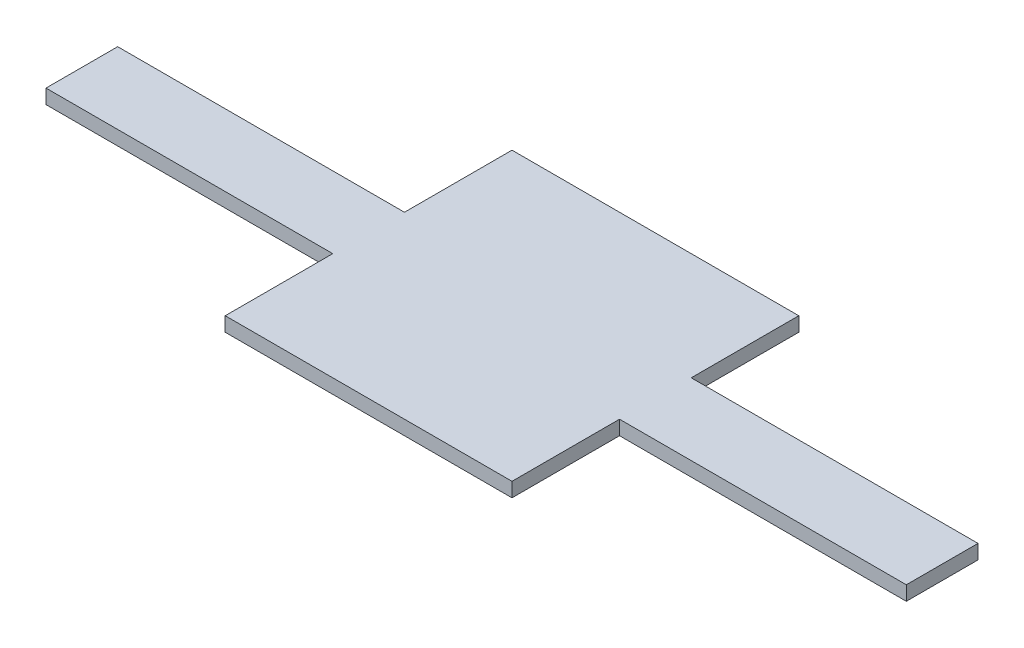
ISO-10303-21;
HEADER;
FILE_DESCRIPTION(('STEP AP214'),'2;1');
FILE_NAME('part.step','',(''),(''),'','','');
FILE_SCHEMA(('AUTOMOTIVE_DESIGN { 1 0 10303 214 1 1 1 1 }'));
ENDSEC;
DATA;
#1=APPLICATION_CONTEXT('core data for automotive mechanical design processes');
#2=APPLICATION_PROTOCOL_DEFINITION('international standard','automotive_design',2000,#1);
#3=PRODUCT_CONTEXT('',#1,'mechanical');
#4=PRODUCT('Part','Part','',(#3));
#5=PRODUCT_RELATED_PRODUCT_CATEGORY('part','',(#4));
#6=PRODUCT_DEFINITION_FORMATION('','',#4);
#7=PRODUCT_DEFINITION_CONTEXT('part definition',#1,'design');
#8=PRODUCT_DEFINITION('design','',#6,#7);
#9=PRODUCT_DEFINITION_SHAPE('','',#8);
#10=(LENGTH_UNIT() NAMED_UNIT(*) SI_UNIT(.MILLI.,.METRE.));
#11=(NAMED_UNIT(*) PLANE_ANGLE_UNIT() SI_UNIT($,.RADIAN.));
#12=(NAMED_UNIT(*) SI_UNIT($,.STERADIAN.) SOLID_ANGLE_UNIT());
#13=UNCERTAINTY_MEASURE_WITH_UNIT(LENGTH_MEASURE(1.E-05),#10,'distance_accuracy_value','');
#14=(GEOMETRIC_REPRESENTATION_CONTEXT(3) GLOBAL_UNCERTAINTY_ASSIGNED_CONTEXT((#13)) GLOBAL_UNIT_ASSIGNED_CONTEXT((#10,
#11,#12)) REPRESENTATION_CONTEXT('',''));
#15=CARTESIAN_POINT('',(0.,0.,0.));
#16=DIRECTION('',(0.,0.,1.));
#17=DIRECTION('',(1.,0.,0.));
#18=AXIS2_PLACEMENT_3D('',#15,#16,#17);
#19=CARTESIAN_POINT('',(0.,0.5,0.));
#20=DIRECTION('',(1.,0.,0.));
#21=DIRECTION('',(0.,0.,-1.));
#22=AXIS2_PLACEMENT_3D('',#19,#20,#21);
#23=PLANE('',#22);
#24=DIRECTION('',(0.,0.,1.));
#25=VECTOR('',#24,1.);
#26=CARTESIAN_POINT('',(0.,0.5,0.));
#27=LINE('',#26,#25);
#28=CARTESIAN_POINT('',(0.,0.5,-3.75));
#29=VERTEX_POINT('',#28);
#30=CARTESIAN_POINT('',(0.,0.5,0.));
#31=VERTEX_POINT('',#30);
#32=EDGE_CURVE('E188',#29,#31,#27,.T.);
#33=ORIENTED_EDGE('',*,*,#32,.F.);
#34=DIRECTION('',(0.,-1.,0.));
#35=VECTOR('',#34,1.);
#36=CARTESIAN_POINT('',(0.,0.5,-3.75));
#37=LINE('',#36,#35);
#38=CARTESIAN_POINT('',(0.,0.,-3.75));
#39=VERTEX_POINT('',#38);
#40=EDGE_CURVE('E180',#29,#39,#37,.T.);
#41=ORIENTED_EDGE('',*,*,#40,.T.);
#42=DIRECTION('',(0.,0.,1.));
#43=VECTOR('',#42,1.);
#44=CARTESIAN_POINT('',(0.,0.,0.));
#45=LINE('',#44,#43);
#46=CARTESIAN_POINT('',(0.,0.,0.));
#47=VERTEX_POINT('',#46);
#48=EDGE_CURVE('E183',#39,#47,#45,.T.);
#49=ORIENTED_EDGE('',*,*,#48,.T.);
#50=DIRECTION('',(0.,-1.,0.));
#51=VECTOR('',#50,1.);
#52=CARTESIAN_POINT('',(0.,0.5,0.));
#53=LINE('',#52,#51);
#54=EDGE_CURVE('E11',#31,#47,#53,.T.);
#55=ORIENTED_EDGE('',*,*,#54,.F.);
#56=EDGE_LOOP('',(#33,#41,#49,#55));
#57=FACE_BOUND('',#56,.T.);
#58=ADVANCED_FACE('F32',(#57),#23,.F.);
#59=CARTESIAN_POINT('',(10.,0.5,0.));
#60=DIRECTION('',(-1.,0.,0.));
#61=DIRECTION('',(0.,0.,1.));
#62=AXIS2_PLACEMENT_3D('',#59,#60,#61);
#63=PLANE('',#62);
#64=DIRECTION('',(0.,0.,-1.));
#65=VECTOR('',#64,1.);
#66=CARTESIAN_POINT('',(10.,0.,0.));
#67=LINE('',#66,#65);
#68=CARTESIAN_POINT('',(10.,0.,0.));
#69=VERTEX_POINT('',#68);
#70=CARTESIAN_POINT('',(10.,0.,-3.75));
#71=VERTEX_POINT('',#70);
#72=EDGE_CURVE('E200',#69,#71,#67,.T.);
#73=ORIENTED_EDGE('',*,*,#72,.T.);
#74=DIRECTION('',(0.,1.,0.));
#75=VECTOR('',#74,1.);
#76=CARTESIAN_POINT('',(10.,0.5,-3.75));
#77=LINE('',#76,#75);
#78=CARTESIAN_POINT('',(10.,0.5,-3.75));
#79=VERTEX_POINT('',#78);
#80=EDGE_CURVE('E55',#71,#79,#77,.T.);
#81=ORIENTED_EDGE('',*,*,#80,.T.);
#82=DIRECTION('',(0.,0.,-1.));
#83=VECTOR('',#82,1.);
#84=CARTESIAN_POINT('',(10.,0.5,0.));
#85=LINE('',#84,#83);
#86=CARTESIAN_POINT('',(10.,0.5,0.));
#87=VERTEX_POINT('',#86);
#88=EDGE_CURVE('E190',#87,#79,#85,.T.);
#89=ORIENTED_EDGE('',*,*,#88,.F.);
#90=DIRECTION('',(0.,-1.,0.));
#91=VECTOR('',#90,1.);
#92=CARTESIAN_POINT('',(10.,0.5,0.));
#93=LINE('',#92,#91);
#94=EDGE_CURVE('E40',#87,#69,#93,.T.);
#95=ORIENTED_EDGE('',*,*,#94,.T.);
#96=EDGE_LOOP('',(#73,#81,#89,#95));
#97=FACE_BOUND('',#96,.T.);
#98=ADVANCED_FACE('F210',(#97),#63,.F.);
#99=CARTESIAN_POINT('',(0.,0.,-10.));
#100=VERTEX_POINT('',#99);
#101=CARTESIAN_POINT('',(0.,0.,-6.25));
#102=VERTEX_POINT('',#101);
#103=EDGE_CURVE('E195',#100,#102,#45,.T.);
#104=ORIENTED_EDGE('',*,*,#103,.T.);
#105=DIRECTION('',(0.,1.,0.));
#106=VECTOR('',#105,1.);
#107=CARTESIAN_POINT('',(0.,0.5,-6.25));
#108=LINE('',#107,#106);
#109=CARTESIAN_POINT('',(0.,0.5,-6.25));
#110=VERTEX_POINT('',#109);
#111=EDGE_CURVE('E177',#102,#110,#108,.T.);
#112=ORIENTED_EDGE('',*,*,#111,.T.);
#113=CARTESIAN_POINT('',(0.,0.5,-10.));
#114=VERTEX_POINT('',#113);
#115=EDGE_CURVE('E184',#114,#110,#27,.T.);
#116=ORIENTED_EDGE('',*,*,#115,.F.);
#117=DIRECTION('',(0.,-1.,0.));
#118=VECTOR('',#117,1.);
#119=CARTESIAN_POINT('',(0.,0.5,-10.));
#120=LINE('',#119,#118);
#121=EDGE_CURVE('E194',#114,#100,#120,.T.);
#122=ORIENTED_EDGE('',*,*,#121,.T.);
#123=EDGE_LOOP('',(#104,#112,#116,#122));
#124=FACE_BOUND('',#123,.T.);
#125=ADVANCED_FACE('F34',(#124),#23,.F.);
#126=CARTESIAN_POINT('',(0.,0.5,0.));
#127=DIRECTION('',(0.,0.,-1.));
#128=DIRECTION('',(-1.,0.,0.));
#129=AXIS2_PLACEMENT_3D('',#126,#127,#128);
#130=PLANE('',#129);
#131=DIRECTION('',(1.,0.,0.));
#132=VECTOR('',#131,1.);
#133=CARTESIAN_POINT('',(0.,0.,0.));
#134=LINE('',#133,#132);
#135=EDGE_CURVE('E197',#47,#69,#134,.T.);
#136=ORIENTED_EDGE('',*,*,#135,.T.);
#137=ORIENTED_EDGE('',*,*,#94,.F.);
#138=DIRECTION('',(1.,0.,0.));
#139=VECTOR('',#138,1.);
#140=CARTESIAN_POINT('',(0.,0.5,0.));
#141=LINE('',#140,#139);
#142=EDGE_CURVE('E187',#31,#87,#141,.T.);
#143=ORIENTED_EDGE('',*,*,#142,.F.);
#144=ORIENTED_EDGE('',*,*,#54,.T.);
#145=EDGE_LOOP('',(#136,#137,#143,#144));
#146=FACE_BOUND('',#145,.T.);
#147=ADVANCED_FACE('F215',(#146),#130,.F.);
#148=CARTESIAN_POINT('',(10.,0.5,-6.25));
#149=VERTEX_POINT('',#148);
#150=CARTESIAN_POINT('',(10.,0.5,-10.));
#151=VERTEX_POINT('',#150);
#152=EDGE_CURVE('E47',#149,#151,#85,.T.);
#153=ORIENTED_EDGE('',*,*,#152,.F.);
#154=DIRECTION('',(0.,-1.,0.));
#155=VECTOR('',#154,1.);
#156=CARTESIAN_POINT('',(10.,0.5,-6.25));
#157=LINE('',#156,#155);
#158=CARTESIAN_POINT('',(10.,0.,-6.25));
#159=VERTEX_POINT('',#158);
#160=EDGE_CURVE('E166',#149,#159,#157,.T.);
#161=ORIENTED_EDGE('',*,*,#160,.T.);
#162=CARTESIAN_POINT('',(10.,0.,-10.));
#163=VERTEX_POINT('',#162);
#164=EDGE_CURVE('E199',#159,#163,#67,.T.);
#165=ORIENTED_EDGE('',*,*,#164,.T.);
#166=DIRECTION('',(0.,-1.,0.));
#167=VECTOR('',#166,1.);
#168=CARTESIAN_POINT('',(10.,0.5,-10.));
#169=LINE('',#168,#167);
#170=EDGE_CURVE('E206',#151,#163,#169,.T.);
#171=ORIENTED_EDGE('',*,*,#170,.F.);
#172=EDGE_LOOP('',(#153,#161,#165,#171));
#173=FACE_BOUND('',#172,.T.);
#174=ADVANCED_FACE('F237',(#173),#63,.F.);
#175=CARTESIAN_POINT('',(0.,0.5,-10.));
#176=DIRECTION('',(0.,0.,1.));
#177=DIRECTION('',(1.,0.,0.));
#178=AXIS2_PLACEMENT_3D('',#175,#176,#177);
#179=PLANE('',#178);
#180=DIRECTION('',(-1.,0.,0.));
#181=VECTOR('',#180,1.);
#182=CARTESIAN_POINT('',(0.,0.,-10.));
#183=LINE('',#182,#181);
#184=EDGE_CURVE('E202',#163,#100,#183,.T.);
#185=ORIENTED_EDGE('',*,*,#184,.T.);
#186=ORIENTED_EDGE('',*,*,#121,.F.);
#187=DIRECTION('',(-1.,0.,0.));
#188=VECTOR('',#187,1.);
#189=CARTESIAN_POINT('',(0.,0.5,-10.));
#190=LINE('',#189,#188);
#191=EDGE_CURVE('E192',#151,#114,#190,.T.);
#192=ORIENTED_EDGE('',*,*,#191,.F.);
#193=ORIENTED_EDGE('',*,*,#170,.T.);
#194=EDGE_LOOP('',(#185,#186,#192,#193));
#195=FACE_BOUND('',#194,.T.);
#196=ADVANCED_FACE('F236',(#195),#179,.F.);
#197=CARTESIAN_POINT('',(0.,0.5,0.));
#198=DIRECTION('',(0.,-1.,0.));
#199=DIRECTION('',(0.,0.,-1.));
#200=AXIS2_PLACEMENT_3D('',#197,#198,#199);
#201=PLANE('',#200);
#202=ORIENTED_EDGE('',*,*,#115,.T.);
#203=DIRECTION('',(1.,0.,0.));
#204=VECTOR('',#203,1.);
#205=CARTESIAN_POINT('',(-10.,0.5,-6.25));
#206=LINE('',#205,#204);
#207=CARTESIAN_POINT('',(-10.,0.5,-6.25));
#208=VERTEX_POINT('',#207);
#209=EDGE_CURVE('E168',#208,#110,#206,.T.);
#210=ORIENTED_EDGE('',*,*,#209,.F.);
#211=DIRECTION('',(0.,0.,1.));
#212=VECTOR('',#211,1.);
#213=CARTESIAN_POINT('',(-10.,0.5,-3.75));
#214=LINE('',#213,#212);
#215=CARTESIAN_POINT('',(-10.,0.5,-3.75));
#216=VERTEX_POINT('',#215);
#217=EDGE_CURVE('E132',#208,#216,#214,.T.);
#218=ORIENTED_EDGE('',*,*,#217,.T.);
#219=DIRECTION('',(1.,0.,0.));
#220=VECTOR('',#219,1.);
#221=CARTESIAN_POINT('',(-10.,0.5,-3.75));
#222=LINE('',#221,#220);
#223=EDGE_CURVE('E163',#216,#29,#222,.T.);
#224=ORIENTED_EDGE('',*,*,#223,.T.);
#225=ORIENTED_EDGE('',*,*,#32,.T.);
#226=ORIENTED_EDGE('',*,*,#142,.T.);
#227=ORIENTED_EDGE('',*,*,#88,.T.);
#228=CARTESIAN_POINT('',(20.,0.5,-3.75));
#229=VERTEX_POINT('',#228);
#230=EDGE_CURVE('E167',#79,#229,#222,.T.);
#231=ORIENTED_EDGE('',*,*,#230,.T.);
#232=DIRECTION('',(0.,0.,1.));
#233=VECTOR('',#232,1.);
#234=CARTESIAN_POINT('',(20.,0.5,-3.75));
#235=LINE('',#234,#233);
#236=CARTESIAN_POINT('',(20.,0.5,-6.25));
#237=VERTEX_POINT('',#236);
#238=EDGE_CURVE('E147',#237,#229,#235,.T.);
#239=ORIENTED_EDGE('',*,*,#238,.F.);
#240=EDGE_CURVE('E171',#149,#237,#206,.T.);
#241=ORIENTED_EDGE('',*,*,#240,.F.);
#242=ORIENTED_EDGE('',*,*,#152,.T.);
#243=ORIENTED_EDGE('',*,*,#191,.T.);
#244=EDGE_LOOP('',(#202,#210,#218,#224,#225,#226,#227,#231,#239,#241,#242,#243));
#245=FACE_BOUND('',#244,.T.);
#246=ADVANCED_FACE('F242',(#245),#201,.F.);
#247=CARTESIAN_POINT('',(0.,0.,0.));
#248=DIRECTION('',(0.,-1.,0.));
#249=DIRECTION('',(0.,0.,-1.));
#250=AXIS2_PLACEMENT_3D('',#247,#248,#249);
#251=PLANE('',#250);
#252=ORIENTED_EDGE('',*,*,#164,.F.);
#253=DIRECTION('',(1.,0.,0.));
#254=VECTOR('',#253,1.);
#255=CARTESIAN_POINT('',(-10.,0.,-6.25));
#256=LINE('',#255,#254);
#257=CARTESIAN_POINT('',(20.,0.,-6.25));
#258=VERTEX_POINT('',#257);
#259=EDGE_CURVE('E138',#159,#258,#256,.T.);
#260=ORIENTED_EDGE('',*,*,#259,.T.);
#261=DIRECTION('',(0.,0.,-1.));
#262=VECTOR('',#261,1.);
#263=CARTESIAN_POINT('',(20.,0.,-3.75));
#264=LINE('',#263,#262);
#265=CARTESIAN_POINT('',(20.,0.,-3.75));
#266=VERTEX_POINT('',#265);
#267=EDGE_CURVE('E135',#266,#258,#264,.T.);
#268=ORIENTED_EDGE('',*,*,#267,.F.);
#269=DIRECTION('',(1.,0.,0.));
#270=VECTOR('',#269,1.);
#271=CARTESIAN_POINT('',(-10.,0.,-3.75));
#272=LINE('',#271,#270);
#273=EDGE_CURVE('E123',#71,#266,#272,.T.);
#274=ORIENTED_EDGE('',*,*,#273,.F.);
#275=ORIENTED_EDGE('',*,*,#72,.F.);
#276=ORIENTED_EDGE('',*,*,#135,.F.);
#277=ORIENTED_EDGE('',*,*,#48,.F.);
#278=CARTESIAN_POINT('',(-10.,0.,-3.75));
#279=VERTEX_POINT('',#278);
#280=EDGE_CURVE('E131',#279,#39,#272,.T.);
#281=ORIENTED_EDGE('',*,*,#280,.F.);
#282=DIRECTION('',(0.,0.,-1.));
#283=VECTOR('',#282,1.);
#284=CARTESIAN_POINT('',(-10.,0.,-3.75));
#285=LINE('',#284,#283);
#286=CARTESIAN_POINT('',(-10.,0.,-6.25));
#287=VERTEX_POINT('',#286);
#288=EDGE_CURVE('E155',#279,#287,#285,.T.);
#289=ORIENTED_EDGE('',*,*,#288,.T.);
#290=EDGE_CURVE('E172',#287,#102,#256,.T.);
#291=ORIENTED_EDGE('',*,*,#290,.T.);
#292=ORIENTED_EDGE('',*,*,#103,.F.);
#293=ORIENTED_EDGE('',*,*,#184,.F.);
#294=EDGE_LOOP('',(#252,#260,#268,#274,#275,#276,#277,#281,#289,#291,#292,#293));
#295=FACE_BOUND('',#294,.T.);
#296=ADVANCED_FACE('F136',(#295),#251,.T.);
#297=CARTESIAN_POINT('',(20.,0.,0.));
#298=DIRECTION('',(-1.,0.,0.));
#299=DIRECTION('',(0.,0.,1.));
#300=AXIS2_PLACEMENT_3D('',#297,#298,#299);
#301=PLANE('',#300);
#302=DIRECTION('',(0.,-1.,0.));
#303=VECTOR('',#302,1.);
#304=CARTESIAN_POINT('',(20.,0.,-3.75));
#305=LINE('',#304,#303);
#306=EDGE_CURVE('E128',#229,#266,#305,.T.);
#307=ORIENTED_EDGE('',*,*,#306,.T.);
#308=ORIENTED_EDGE('',*,*,#267,.T.);
#309=DIRECTION('',(0.,1.,0.));
#310=VECTOR('',#309,1.);
#311=CARTESIAN_POINT('',(20.,0.,-6.25));
#312=LINE('',#311,#310);
#313=EDGE_CURVE('E142',#258,#237,#312,.T.);
#314=ORIENTED_EDGE('',*,*,#313,.T.);
#315=ORIENTED_EDGE('',*,*,#238,.T.);
#316=EDGE_LOOP('',(#307,#308,#314,#315));
#317=FACE_BOUND('',#316,.T.);
#318=ADVANCED_FACE('F145',(#317),#301,.F.);
#319=CARTESIAN_POINT('',(-10.,0.,-6.25));
#320=DIRECTION('',(0.,0.,-1.));
#321=DIRECTION('',(-1.,0.,0.));
#322=AXIS2_PLACEMENT_3D('',#319,#320,#321);
#323=PLANE('',#322);
#324=ORIENTED_EDGE('',*,*,#160,.F.);
#325=ORIENTED_EDGE('',*,*,#240,.T.);
#326=ORIENTED_EDGE('',*,*,#313,.F.);
#327=ORIENTED_EDGE('',*,*,#259,.F.);
#328=EDGE_LOOP('',(#324,#325,#326,#327));
#329=FACE_BOUND('',#328,.T.);
#330=ADVANCED_FACE('F240',(#329),#323,.T.);
#331=CARTESIAN_POINT('',(-10.,0.,-3.75));
#332=DIRECTION('',(0.,0.,1.));
#333=DIRECTION('',(1.,0.,0.));
#334=AXIS2_PLACEMENT_3D('',#331,#332,#333);
#335=PLANE('',#334);
#336=ORIENTED_EDGE('',*,*,#80,.F.);
#337=ORIENTED_EDGE('',*,*,#273,.T.);
#338=ORIENTED_EDGE('',*,*,#306,.F.);
#339=ORIENTED_EDGE('',*,*,#230,.F.);
#340=EDGE_LOOP('',(#336,#337,#338,#339));
#341=FACE_BOUND('',#340,.T.);
#342=ADVANCED_FACE('F125',(#341),#335,.T.);
#343=ORIENTED_EDGE('',*,*,#40,.F.);
#344=ORIENTED_EDGE('',*,*,#223,.F.);
#345=DIRECTION('',(0.,-1.,0.));
#346=VECTOR('',#345,1.);
#347=CARTESIAN_POINT('',(-10.,0.,-3.75));
#348=LINE('',#347,#346);
#349=EDGE_CURVE('E152',#216,#279,#348,.T.);
#350=ORIENTED_EDGE('',*,*,#349,.T.);
#351=ORIENTED_EDGE('',*,*,#280,.T.);
#352=EDGE_LOOP('',(#343,#344,#350,#351));
#353=FACE_BOUND('',#352,.T.);
#354=ADVANCED_FACE('F219',(#353),#335,.T.);
#355=ORIENTED_EDGE('',*,*,#111,.F.);
#356=ORIENTED_EDGE('',*,*,#290,.F.);
#357=DIRECTION('',(0.,1.,0.));
#358=VECTOR('',#357,1.);
#359=CARTESIAN_POINT('',(-10.,0.,-6.25));
#360=LINE('',#359,#358);
#361=EDGE_CURVE('E158',#287,#208,#360,.T.);
#362=ORIENTED_EDGE('',*,*,#361,.T.);
#363=ORIENTED_EDGE('',*,*,#209,.T.);
#364=EDGE_LOOP('',(#355,#356,#362,#363));
#365=FACE_BOUND('',#364,.T.);
#366=ADVANCED_FACE('F228',(#365),#323,.T.);
#367=CARTESIAN_POINT('',(-10.,0.,0.));
#368=DIRECTION('',(-1.,0.,0.));
#369=DIRECTION('',(0.,0.,1.));
#370=AXIS2_PLACEMENT_3D('',#367,#368,#369);
#371=PLANE('',#370);
#372=ORIENTED_EDGE('',*,*,#349,.F.);
#373=ORIENTED_EDGE('',*,*,#217,.F.);
#374=ORIENTED_EDGE('',*,*,#361,.F.);
#375=ORIENTED_EDGE('',*,*,#288,.F.);
#376=EDGE_LOOP('',(#372,#373,#374,#375));
#377=FACE_BOUND('',#376,.T.);
#378=ADVANCED_FACE('F224',(#377),#371,.T.);
#379=CLOSED_SHELL('',(#58,#98,#125,#147,#174,#196,#246,#296,#318,#330,#342,#354,#366,#378));
#380=MANIFOLD_SOLID_BREP('B2',#379);
#381=ADVANCED_BREP_SHAPE_REPRESENTATION('',(#18,#380),#14);
#382=SHAPE_DEFINITION_REPRESENTATION(#9,#381);
ENDSEC;
END-ISO-10303-21;
